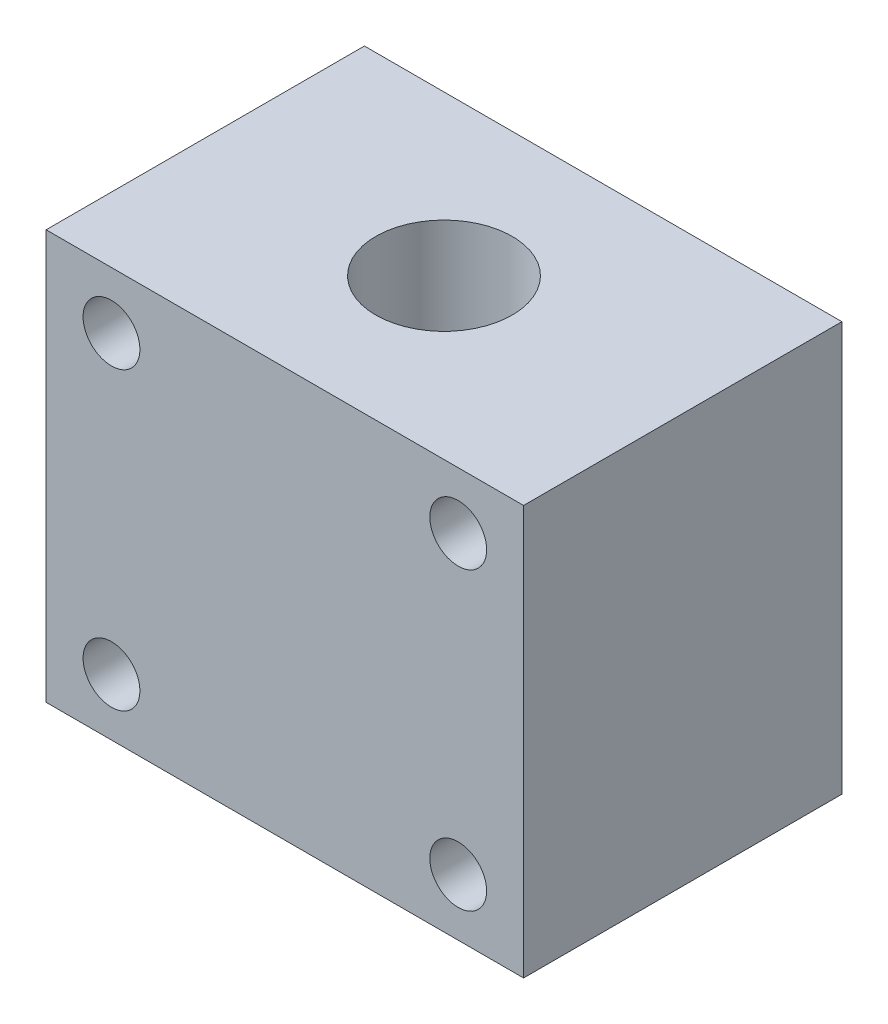
ISO-10303-21;
HEADER;
FILE_DESCRIPTION(('STEP AP214'),'2;1');
FILE_NAME('part.step','',(''),(''),'','','');
FILE_SCHEMA(('AUTOMOTIVE_DESIGN { 1 0 10303 214 1 1 1 1 }'));
ENDSEC;
DATA;
#1=APPLICATION_CONTEXT('core data for automotive mechanical design processes');
#2=APPLICATION_PROTOCOL_DEFINITION('international standard','automotive_design',2000,#1);
#3=PRODUCT_CONTEXT('',#1,'mechanical');
#4=PRODUCT('Part','Part','',(#3));
#5=PRODUCT_RELATED_PRODUCT_CATEGORY('part','',(#4));
#6=PRODUCT_DEFINITION_FORMATION('','',#4);
#7=PRODUCT_DEFINITION_CONTEXT('part definition',#1,'design');
#8=PRODUCT_DEFINITION('design','',#6,#7);
#9=PRODUCT_DEFINITION_SHAPE('','',#8);
#10=(LENGTH_UNIT() NAMED_UNIT(*) SI_UNIT(.MILLI.,.METRE.));
#11=(NAMED_UNIT(*) PLANE_ANGLE_UNIT() SI_UNIT($,.RADIAN.));
#12=(NAMED_UNIT(*) SI_UNIT($,.STERADIAN.) SOLID_ANGLE_UNIT());
#13=UNCERTAINTY_MEASURE_WITH_UNIT(LENGTH_MEASURE(1.E-05),#10,'distance_accuracy_value','');
#14=(GEOMETRIC_REPRESENTATION_CONTEXT(3) GLOBAL_UNCERTAINTY_ASSIGNED_CONTEXT((#13)) GLOBAL_UNIT_ASSIGNED_CONTEXT((#10,
#11,#12)) REPRESENTATION_CONTEXT('',''));
#15=CARTESIAN_POINT('',(0.,0.,0.));
#16=DIRECTION('',(0.,0.,1.));
#17=DIRECTION('',(1.,0.,0.));
#18=AXIS2_PLACEMENT_3D('',#15,#16,#17);
#19=CARTESIAN_POINT('',(0.,18.,0.));
#20=DIRECTION('',(0.,-1.,0.));
#21=DIRECTION('',(0.,0.,-1.));
#22=AXIS2_PLACEMENT_3D('',#19,#20,#21);
#23=PLANE('',#22);
#24=DIRECTION('',(0.,0.,-1.));
#25=VECTOR('',#24,1.);
#26=CARTESIAN_POINT('',(21.,18.,14.));
#27=LINE('',#26,#25);
#28=CARTESIAN_POINT('',(21.,18.,14.));
#29=VERTEX_POINT('',#28);
#30=CARTESIAN_POINT('',(21.,18.,-14.));
#31=VERTEX_POINT('',#30);
#32=EDGE_CURVE('E120',#29,#31,#27,.T.);
#33=ORIENTED_EDGE('',*,*,#32,.T.);
#34=DIRECTION('',(-1.,0.,0.));
#35=VECTOR('',#34,1.);
#36=CARTESIAN_POINT('',(-21.,18.,-14.));
#37=LINE('',#36,#35);
#38=CARTESIAN_POINT('',(-21.,18.,-14.));
#39=VERTEX_POINT('',#38);
#40=EDGE_CURVE('E86',#31,#39,#37,.T.);
#41=ORIENTED_EDGE('',*,*,#40,.T.);
#42=DIRECTION('',(0.,0.,1.));
#43=VECTOR('',#42,1.);
#44=CARTESIAN_POINT('',(-21.,18.,14.));
#45=LINE('',#44,#43);
#46=CARTESIAN_POINT('',(-21.,18.,14.));
#47=VERTEX_POINT('',#46);
#48=EDGE_CURVE('E62',#39,#47,#45,.T.);
#49=ORIENTED_EDGE('',*,*,#48,.T.);
#50=DIRECTION('',(1.,0.,0.));
#51=VECTOR('',#50,1.);
#52=CARTESIAN_POINT('',(-21.,18.,14.));
#53=LINE('',#52,#51);
#54=EDGE_CURVE('E57',#47,#29,#53,.T.);
#55=ORIENTED_EDGE('',*,*,#54,.T.);
#56=EDGE_LOOP('',(#33,#41,#49,#55));
#57=FACE_BOUND('',#56,.T.);
#58=CARTESIAN_POINT('',(0.,18.,0.));
#59=DIRECTION('',(0.,1.,0.));
#60=DIRECTION('',(0.,0.,1.));
#61=AXIS2_PLACEMENT_3D('',#58,#59,#60);
#62=CIRCLE('',#61,6.);
#63=CARTESIAN_POINT('',(0.,18.,6.));
#64=VERTEX_POINT('',#63);
#65=EDGE_CURVE('E116',#64,#64,#62,.T.);
#66=ORIENTED_EDGE('',*,*,#65,.F.);
#67=EDGE_LOOP('',(#66));
#68=FACE_BOUND('',#67,.T.);
#69=ADVANCED_FACE('F41',(#57,#68),#23,.F.);
#70=CARTESIAN_POINT('',(21.,18.,14.));
#71=DIRECTION('',(-1.,0.,0.));
#72=DIRECTION('',(0.,0.,1.));
#73=AXIS2_PLACEMENT_3D('',#70,#71,#72);
#74=PLANE('',#73);
#75=DIRECTION('',(0.,-1.,0.));
#76=VECTOR('',#75,1.);
#77=CARTESIAN_POINT('',(21.,18.,14.));
#78=LINE('',#77,#76);
#79=CARTESIAN_POINT('',(21.,-18.,14.));
#80=VERTEX_POINT('',#79);
#81=EDGE_CURVE('E101',#29,#80,#78,.T.);
#82=ORIENTED_EDGE('',*,*,#81,.T.);
#83=DIRECTION('',(0.,0.,-1.));
#84=VECTOR('',#83,1.);
#85=CARTESIAN_POINT('',(21.,-18.,14.));
#86=LINE('',#85,#84);
#87=CARTESIAN_POINT('',(21.,-18.,-14.));
#88=VERTEX_POINT('',#87);
#89=EDGE_CURVE('E95',#80,#88,#86,.T.);
#90=ORIENTED_EDGE('',*,*,#89,.T.);
#91=DIRECTION('',(0.,-1.,0.));
#92=VECTOR('',#91,1.);
#93=CARTESIAN_POINT('',(21.,18.,-14.));
#94=LINE('',#93,#92);
#95=EDGE_CURVE('E11',#31,#88,#94,.T.);
#96=ORIENTED_EDGE('',*,*,#95,.F.);
#97=ORIENTED_EDGE('',*,*,#32,.F.);
#98=EDGE_LOOP('',(#82,#90,#96,#97));
#99=FACE_BOUND('',#98,.T.);
#100=ADVANCED_FACE('F43',(#99),#74,.F.);
#101=CARTESIAN_POINT('',(-21.,18.,-14.));
#102=DIRECTION('',(0.,0.,1.));
#103=DIRECTION('',(1.,0.,0.));
#104=AXIS2_PLACEMENT_3D('',#101,#102,#103);
#105=PLANE('',#104);
#106=CARTESIAN_POINT('',(-15.25,13.,-14.));
#107=DIRECTION('',(0.,0.,1.));
#108=DIRECTION('',(-1.,0.,0.));
#109=AXIS2_PLACEMENT_3D('',#106,#107,#108);
#110=CIRCLE('',#109,2.5);
#111=CARTESIAN_POINT('',(-17.75,13.,-14.));
#112=VERTEX_POINT('',#111);
#113=EDGE_CURVE('E172',#112,#112,#110,.T.);
#114=ORIENTED_EDGE('',*,*,#113,.T.);
#115=EDGE_LOOP('',(#114));
#116=FACE_BOUND('',#115,.T.);
#117=CARTESIAN_POINT('',(15.25,-13.,-14.));
#118=DIRECTION('',(0.,0.,1.));
#119=DIRECTION('',(-1.,0.,0.));
#120=AXIS2_PLACEMENT_3D('',#117,#118,#119);
#121=CIRCLE('',#120,2.5);
#122=CARTESIAN_POINT('',(12.75,-13.,-14.));
#123=VERTEX_POINT('',#122);
#124=EDGE_CURVE('E176',#123,#123,#121,.T.);
#125=ORIENTED_EDGE('',*,*,#124,.T.);
#126=EDGE_LOOP('',(#125));
#127=FACE_BOUND('',#126,.T.);
#128=CARTESIAN_POINT('',(-15.25,-13.,-14.));
#129=DIRECTION('',(0.,0.,1.));
#130=DIRECTION('',(1.,0.,0.));
#131=AXIS2_PLACEMENT_3D('',#128,#129,#130);
#132=CIRCLE('',#131,2.49999999999998);
#133=CARTESIAN_POINT('',(-12.75,-13.,-14.));
#134=VERTEX_POINT('',#133);
#135=EDGE_CURVE('E180',#134,#134,#132,.T.);
#136=ORIENTED_EDGE('',*,*,#135,.T.);
#137=EDGE_LOOP('',(#136));
#138=FACE_BOUND('',#137,.T.);
#139=CARTESIAN_POINT('',(15.25,13.,-14.));
#140=DIRECTION('',(0.,0.,1.));
#141=DIRECTION('',(1.,0.,0.));
#142=AXIS2_PLACEMENT_3D('',#139,#140,#141);
#143=CIRCLE('',#142,2.5);
#144=CARTESIAN_POINT('',(17.75,13.,-14.));
#145=VERTEX_POINT('',#144);
#146=EDGE_CURVE('E107',#145,#145,#143,.T.);
#147=ORIENTED_EDGE('',*,*,#146,.T.);
#148=EDGE_LOOP('',(#147));
#149=FACE_BOUND('',#148,.T.);
#150=ORIENTED_EDGE('',*,*,#95,.T.);
#151=DIRECTION('',(-1.,0.,0.));
#152=VECTOR('',#151,1.);
#153=CARTESIAN_POINT('',(-21.,-18.,-14.));
#154=LINE('',#153,#152);
#155=CARTESIAN_POINT('',(-21.,-18.,-14.));
#156=VERTEX_POINT('',#155);
#157=EDGE_CURVE('E85',#88,#156,#154,.T.);
#158=ORIENTED_EDGE('',*,*,#157,.T.);
#159=DIRECTION('',(0.,-1.,0.));
#160=VECTOR('',#159,1.);
#161=CARTESIAN_POINT('',(-21.,18.,-14.));
#162=LINE('',#161,#160);
#163=EDGE_CURVE('E50',#39,#156,#162,.T.);
#164=ORIENTED_EDGE('',*,*,#163,.F.);
#165=ORIENTED_EDGE('',*,*,#40,.F.);
#166=EDGE_LOOP('',(#150,#158,#164,#165));
#167=FACE_BOUND('',#166,.T.);
#168=ADVANCED_FACE('F83',(#116,#127,#138,#149,#167),#105,.F.);
#169=CARTESIAN_POINT('',(-21.,18.,14.));
#170=DIRECTION('',(1.,0.,0.));
#171=DIRECTION('',(0.,0.,-1.));
#172=AXIS2_PLACEMENT_3D('',#169,#170,#171);
#173=PLANE('',#172);
#174=ORIENTED_EDGE('',*,*,#163,.T.);
#175=DIRECTION('',(0.,0.,1.));
#176=VECTOR('',#175,1.);
#177=CARTESIAN_POINT('',(-21.,-18.,14.));
#178=LINE('',#177,#176);
#179=CARTESIAN_POINT('',(-21.,-18.,14.));
#180=VERTEX_POINT('',#179);
#181=EDGE_CURVE('E98',#156,#180,#178,.T.);
#182=ORIENTED_EDGE('',*,*,#181,.T.);
#183=DIRECTION('',(0.,-1.,0.));
#184=VECTOR('',#183,1.);
#185=CARTESIAN_POINT('',(-21.,18.,14.));
#186=LINE('',#185,#184);
#187=EDGE_CURVE('E131',#47,#180,#186,.T.);
#188=ORIENTED_EDGE('',*,*,#187,.F.);
#189=ORIENTED_EDGE('',*,*,#48,.F.);
#190=EDGE_LOOP('',(#174,#182,#188,#189));
#191=FACE_BOUND('',#190,.T.);
#192=ADVANCED_FACE('F135',(#191),#173,.F.);
#193=CARTESIAN_POINT('',(-21.,18.,14.));
#194=DIRECTION('',(0.,0.,-1.));
#195=DIRECTION('',(-1.,0.,0.));
#196=AXIS2_PLACEMENT_3D('',#193,#194,#195);
#197=PLANE('',#196);
#198=CARTESIAN_POINT('',(-15.25,13.,14.));
#199=DIRECTION('',(0.,0.,1.));
#200=DIRECTION('',(-1.,0.,0.));
#201=AXIS2_PLACEMENT_3D('',#198,#199,#200);
#202=CIRCLE('',#201,2.5);
#203=CARTESIAN_POINT('',(-17.75,13.,14.));
#204=VERTEX_POINT('',#203);
#205=EDGE_CURVE('E191',#204,#204,#202,.T.);
#206=ORIENTED_EDGE('',*,*,#205,.F.);
#207=EDGE_LOOP('',(#206));
#208=FACE_BOUND('',#207,.T.);
#209=CARTESIAN_POINT('',(15.25,-13.,14.));
#210=DIRECTION('',(0.,0.,1.));
#211=DIRECTION('',(-1.,0.,0.));
#212=AXIS2_PLACEMENT_3D('',#209,#210,#211);
#213=CIRCLE('',#212,2.5);
#214=CARTESIAN_POINT('',(12.75,-13.,14.));
#215=VERTEX_POINT('',#214);
#216=EDGE_CURVE('E192',#215,#215,#213,.T.);
#217=ORIENTED_EDGE('',*,*,#216,.F.);
#218=EDGE_LOOP('',(#217));
#219=FACE_BOUND('',#218,.T.);
#220=CARTESIAN_POINT('',(-15.25,-13.,14.));
#221=DIRECTION('',(0.,0.,1.));
#222=DIRECTION('',(1.,0.,0.));
#223=AXIS2_PLACEMENT_3D('',#220,#221,#222);
#224=CIRCLE('',#223,2.49999999999998);
#225=CARTESIAN_POINT('',(-12.75,-13.,14.));
#226=VERTEX_POINT('',#225);
#227=EDGE_CURVE('E203',#226,#226,#224,.T.);
#228=ORIENTED_EDGE('',*,*,#227,.F.);
#229=EDGE_LOOP('',(#228));
#230=FACE_BOUND('',#229,.T.);
#231=CARTESIAN_POINT('',(15.25,13.,14.));
#232=DIRECTION('',(0.,0.,1.));
#233=DIRECTION('',(1.,0.,0.));
#234=AXIS2_PLACEMENT_3D('',#231,#232,#233);
#235=CIRCLE('',#234,2.5);
#236=CARTESIAN_POINT('',(17.75,13.,14.));
#237=VERTEX_POINT('',#236);
#238=EDGE_CURVE('E184',#237,#237,#235,.T.);
#239=ORIENTED_EDGE('',*,*,#238,.F.);
#240=EDGE_LOOP('',(#239));
#241=FACE_BOUND('',#240,.T.);
#242=ORIENTED_EDGE('',*,*,#187,.T.);
#243=DIRECTION('',(1.,0.,0.));
#244=VECTOR('',#243,1.);
#245=CARTESIAN_POINT('',(-21.,-18.,14.));
#246=LINE('',#245,#244);
#247=EDGE_CURVE('E113',#180,#80,#246,.T.);
#248=ORIENTED_EDGE('',*,*,#247,.T.);
#249=ORIENTED_EDGE('',*,*,#81,.F.);
#250=ORIENTED_EDGE('',*,*,#54,.F.);
#251=EDGE_LOOP('',(#242,#248,#249,#250));
#252=FACE_BOUND('',#251,.T.);
#253=ADVANCED_FACE('F137',(#208,#219,#230,#241,#252),#197,.F.);
#254=CARTESIAN_POINT('',(0.,18.,0.));
#255=DIRECTION('',(0.,-1.,0.));
#256=DIRECTION('',(0.,0.,-1.));
#257=AXIS2_PLACEMENT_3D('',#254,#255,#256);
#258=CYLINDRICAL_SURFACE('',#257,6.);
#259=ORIENTED_EDGE('',*,*,#65,.T.);
#260=EDGE_LOOP('',(#259));
#261=FACE_BOUND('',#260,.T.);
#262=CARTESIAN_POINT('',(0.,-18.,0.));
#263=DIRECTION('',(0.,1.,0.));
#264=DIRECTION('',(0.,0.,1.));
#265=AXIS2_PLACEMENT_3D('',#262,#263,#264);
#266=CIRCLE('',#265,6.);
#267=CARTESIAN_POINT('',(0.,-18.,6.));
#268=VERTEX_POINT('',#267);
#269=EDGE_CURVE('E103',#268,#268,#266,.T.);
#270=ORIENTED_EDGE('',*,*,#269,.F.);
#271=EDGE_LOOP('',(#270));
#272=FACE_BOUND('',#271,.T.);
#273=ADVANCED_FACE('F143',(#261,#272),#258,.F.);
#274=CARTESIAN_POINT('',(0.,-18.,0.));
#275=DIRECTION('',(0.,-1.,0.));
#276=DIRECTION('',(0.,0.,-1.));
#277=AXIS2_PLACEMENT_3D('',#274,#275,#276);
#278=PLANE('',#277);
#279=ORIENTED_EDGE('',*,*,#269,.T.);
#280=EDGE_LOOP('',(#279));
#281=FACE_BOUND('',#280,.T.);
#282=ORIENTED_EDGE('',*,*,#89,.F.);
#283=ORIENTED_EDGE('',*,*,#247,.F.);
#284=ORIENTED_EDGE('',*,*,#181,.F.);
#285=ORIENTED_EDGE('',*,*,#157,.F.);
#286=EDGE_LOOP('',(#282,#283,#284,#285));
#287=FACE_BOUND('',#286,.T.);
#288=ADVANCED_FACE('F93',(#281,#287),#278,.T.);
#289=CARTESIAN_POINT('',(15.25,13.,-14.));
#290=DIRECTION('',(0.,0.,1.));
#291=DIRECTION('',(1.,0.,0.));
#292=AXIS2_PLACEMENT_3D('',#289,#290,#291);
#293=CYLINDRICAL_SURFACE('',#292,2.5);
#294=ORIENTED_EDGE('',*,*,#146,.F.);
#295=EDGE_LOOP('',(#294));
#296=FACE_BOUND('',#295,.T.);
#297=ORIENTED_EDGE('',*,*,#238,.T.);
#298=EDGE_LOOP('',(#297));
#299=FACE_BOUND('',#298,.T.);
#300=ADVANCED_FACE('F150',(#296,#299),#293,.F.);
#301=CARTESIAN_POINT('',(-15.25,-13.,-14.));
#302=DIRECTION('',(0.,0.,1.));
#303=DIRECTION('',(1.,0.,0.));
#304=AXIS2_PLACEMENT_3D('',#301,#302,#303);
#305=CYLINDRICAL_SURFACE('',#304,2.49999999999998);
#306=ORIENTED_EDGE('',*,*,#135,.F.);
#307=EDGE_LOOP('',(#306));
#308=FACE_BOUND('',#307,.T.);
#309=ORIENTED_EDGE('',*,*,#227,.T.);
#310=EDGE_LOOP('',(#309));
#311=FACE_BOUND('',#310,.T.);
#312=ADVANCED_FACE('F155',(#308,#311),#305,.F.);
#313=CARTESIAN_POINT('',(15.25,-13.,-14.));
#314=DIRECTION('',(0.,0.,1.));
#315=DIRECTION('',(1.,0.,0.));
#316=AXIS2_PLACEMENT_3D('',#313,#314,#315);
#317=CYLINDRICAL_SURFACE('',#316,2.5);
#318=ORIENTED_EDGE('',*,*,#124,.F.);
#319=EDGE_LOOP('',(#318));
#320=FACE_BOUND('',#319,.T.);
#321=ORIENTED_EDGE('',*,*,#216,.T.);
#322=EDGE_LOOP('',(#321));
#323=FACE_BOUND('',#322,.T.);
#324=ADVANCED_FACE('F213',(#320,#323),#317,.F.);
#325=CARTESIAN_POINT('',(-15.25,13.,-14.));
#326=DIRECTION('',(0.,0.,1.));
#327=DIRECTION('',(1.,0.,0.));
#328=AXIS2_PLACEMENT_3D('',#325,#326,#327);
#329=CYLINDRICAL_SURFACE('',#328,2.5);
#330=ORIENTED_EDGE('',*,*,#113,.F.);
#331=EDGE_LOOP('',(#330));
#332=FACE_BOUND('',#331,.T.);
#333=ORIENTED_EDGE('',*,*,#205,.T.);
#334=EDGE_LOOP('',(#333));
#335=FACE_BOUND('',#334,.T.);
#336=ADVANCED_FACE('F219',(#332,#335),#329,.F.);
#337=CLOSED_SHELL('',(#69,#100,#168,#192,#253,#273,#288,#300,#312,#324,#336));
#338=MANIFOLD_SOLID_BREP('B2',#337);
#339=ADVANCED_BREP_SHAPE_REPRESENTATION('',(#18,#338),#14);
#340=SHAPE_DEFINITION_REPRESENTATION(#9,#339);
ENDSEC;
END-ISO-10303-21;
